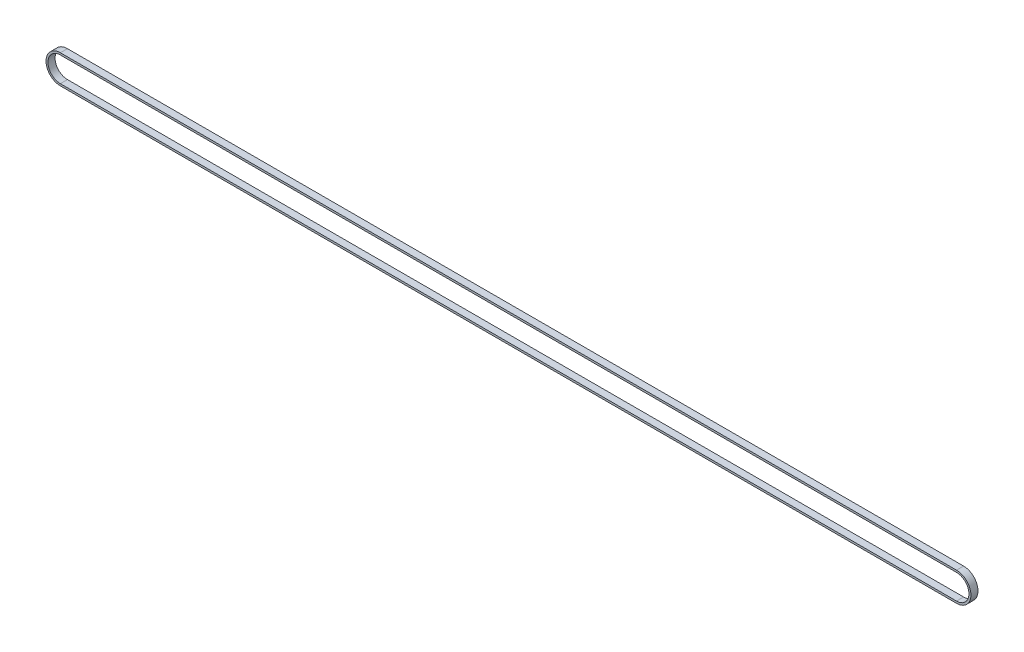
ISO-10303-21;
HEADER;
FILE_DESCRIPTION(('STEP AP214'),'2;1');
FILE_NAME('part.step','',(''),(''),'','','');
FILE_SCHEMA(('AUTOMOTIVE_DESIGN { 1 0 10303 214 1 1 1 1 }'));
ENDSEC;
DATA;
#1=APPLICATION_CONTEXT('core data for automotive mechanical design processes');
#2=APPLICATION_PROTOCOL_DEFINITION('international standard','automotive_design',2000,#1);
#3=PRODUCT_CONTEXT('',#1,'mechanical');
#4=PRODUCT('Part','Part','',(#3));
#5=PRODUCT_RELATED_PRODUCT_CATEGORY('part','',(#4));
#6=PRODUCT_DEFINITION_FORMATION('','',#4);
#7=PRODUCT_DEFINITION_CONTEXT('part definition',#1,'design');
#8=PRODUCT_DEFINITION('design','',#6,#7);
#9=PRODUCT_DEFINITION_SHAPE('','',#8);
#10=(LENGTH_UNIT() NAMED_UNIT(*) SI_UNIT(.MILLI.,.METRE.));
#11=(NAMED_UNIT(*) PLANE_ANGLE_UNIT() SI_UNIT($,.RADIAN.));
#12=(NAMED_UNIT(*) SI_UNIT($,.STERADIAN.) SOLID_ANGLE_UNIT());
#13=UNCERTAINTY_MEASURE_WITH_UNIT(LENGTH_MEASURE(1.E-05),#10,'distance_accuracy_value','');
#14=(GEOMETRIC_REPRESENTATION_CONTEXT(3) GLOBAL_UNCERTAINTY_ASSIGNED_CONTEXT((#13)) GLOBAL_UNIT_ASSIGNED_CONTEXT((#10,
#11,#12)) REPRESENTATION_CONTEXT('',''));
#15=CARTESIAN_POINT('',(0.,0.,0.));
#16=DIRECTION('',(0.,0.,1.));
#17=DIRECTION('',(1.,0.,0.));
#18=AXIS2_PLACEMENT_3D('',#15,#16,#17);
#19=CARTESIAN_POINT('',(0.,0.,2.5));
#20=DIRECTION('',(0.,0.,1.));
#21=DIRECTION('',(1.,0.,0.));
#22=AXIS2_PLACEMENT_3D('',#19,#20,#21);
#23=PLANE('',#22);
#24=CARTESIAN_POINT('',(0.,0.,2.5));
#25=DIRECTION('',(0.,0.,1.));
#26=DIRECTION('',(1.,0.,0.));
#27=AXIS2_PLACEMENT_3D('',#24,#25,#26);
#28=CIRCLE('',#27,10.13);
#29=CARTESIAN_POINT('',(0.,10.13,2.5));
#30=VERTEX_POINT('',#29);
#31=CARTESIAN_POINT('',(0.,-10.13,2.5));
#32=VERTEX_POINT('',#31);
#33=EDGE_CURVE('E159',#30,#32,#28,.T.);
#34=ORIENTED_EDGE('',*,*,#33,.T.);
#35=DIRECTION('',(1.,0.,0.));
#36=VECTOR('',#35,1.);
#37=CARTESIAN_POINT('',(632.,-10.13,2.5));
#38=LINE('',#37,#36);
#39=CARTESIAN_POINT('',(632.,-10.13,2.5));
#40=VERTEX_POINT('',#39);
#41=EDGE_CURVE('E162',#32,#40,#38,.T.);
#42=ORIENTED_EDGE('',*,*,#41,.T.);
#43=CARTESIAN_POINT('',(632.,0.,2.5));
#44=DIRECTION('',(0.,0.,1.));
#45=DIRECTION('',(1.,0.,0.));
#46=AXIS2_PLACEMENT_3D('',#43,#44,#45);
#47=CIRCLE('',#46,10.13);
#48=CARTESIAN_POINT('',(632.,10.13,2.5));
#49=VERTEX_POINT('',#48);
#50=EDGE_CURVE('E165',#40,#49,#47,.T.);
#51=ORIENTED_EDGE('',*,*,#50,.T.);
#52=DIRECTION('',(-1.,0.,0.));
#53=VECTOR('',#52,1.);
#54=CARTESIAN_POINT('',(0.,10.13,2.5));
#55=LINE('',#54,#53);
#56=EDGE_CURVE('E167',#49,#30,#55,.T.);
#57=ORIENTED_EDGE('',*,*,#56,.T.);
#58=EDGE_LOOP('',(#34,#42,#51,#57));
#59=FACE_BOUND('',#58,.T.);
#60=DIRECTION('',(1.,0.,0.));
#61=VECTOR('',#60,1.);
#62=CARTESIAN_POINT('',(632.,-8.75,2.5));
#63=LINE('',#62,#61);
#64=CARTESIAN_POINT('',(0.,-8.75,2.5));
#65=VERTEX_POINT('',#64);
#66=CARTESIAN_POINT('',(632.,-8.75,2.5));
#67=VERTEX_POINT('',#66);
#68=EDGE_CURVE('E131',#65,#67,#63,.T.);
#69=ORIENTED_EDGE('',*,*,#68,.F.);
#70=CARTESIAN_POINT('',(0.,0.,2.5));
#71=DIRECTION('',(0.,0.,1.));
#72=DIRECTION('',(1.,0.,0.));
#73=AXIS2_PLACEMENT_3D('',#70,#71,#72);
#74=CIRCLE('',#73,8.75);
#75=CARTESIAN_POINT('',(0.,8.75,2.5));
#76=VERTEX_POINT('',#75);
#77=EDGE_CURVE('E123',#76,#65,#74,.T.);
#78=ORIENTED_EDGE('',*,*,#77,.F.);
#79=DIRECTION('',(-1.,0.,0.));
#80=VECTOR('',#79,1.);
#81=CARTESIAN_POINT('',(0.,8.75,2.5));
#82=LINE('',#81,#80);
#83=CARTESIAN_POINT('',(632.,8.75,2.5));
#84=VERTEX_POINT('',#83);
#85=EDGE_CURVE('E145',#84,#76,#82,.T.);
#86=ORIENTED_EDGE('',*,*,#85,.F.);
#87=CARTESIAN_POINT('',(632.,0.,2.5));
#88=DIRECTION('',(0.,0.,1.));
#89=DIRECTION('',(1.,0.,0.));
#90=AXIS2_PLACEMENT_3D('',#87,#88,#89);
#91=CIRCLE('',#90,8.75);
#92=EDGE_CURVE('E143',#67,#84,#91,.T.);
#93=ORIENTED_EDGE('',*,*,#92,.F.);
#94=EDGE_LOOP('',(#69,#78,#86,#93));
#95=FACE_BOUND('',#94,.T.);
#96=ADVANCED_FACE('F58',(#59,#95),#23,.T.);
#97=CARTESIAN_POINT('',(0.,0.,-2.5));
#98=DIRECTION('',(0.,0.,1.));
#99=DIRECTION('',(1.,0.,0.));
#100=AXIS2_PLACEMENT_3D('',#97,#98,#99);
#101=PLANE('',#100);
#102=CARTESIAN_POINT('',(0.,0.,-2.5));
#103=DIRECTION('',(0.,0.,1.));
#104=DIRECTION('',(1.,0.,0.));
#105=AXIS2_PLACEMENT_3D('',#102,#103,#104);
#106=CIRCLE('',#105,10.13);
#107=CARTESIAN_POINT('',(0.,10.13,-2.5));
#108=VERTEX_POINT('',#107);
#109=CARTESIAN_POINT('',(0.,-10.13,-2.5));
#110=VERTEX_POINT('',#109);
#111=EDGE_CURVE('E139',#108,#110,#106,.T.);
#112=ORIENTED_EDGE('',*,*,#111,.F.);
#113=DIRECTION('',(-1.,0.,0.));
#114=VECTOR('',#113,1.);
#115=CARTESIAN_POINT('',(0.,10.13,-2.5));
#116=LINE('',#115,#114);
#117=CARTESIAN_POINT('',(632.,10.13,-2.5));
#118=VERTEX_POINT('',#117);
#119=EDGE_CURVE('E163',#118,#108,#116,.T.);
#120=ORIENTED_EDGE('',*,*,#119,.F.);
#121=CARTESIAN_POINT('',(632.,0.,-2.5));
#122=DIRECTION('',(0.,0.,1.));
#123=DIRECTION('',(1.,0.,0.));
#124=AXIS2_PLACEMENT_3D('',#121,#122,#123);
#125=CIRCLE('',#124,10.13);
#126=CARTESIAN_POINT('',(632.,-10.13,-2.5));
#127=VERTEX_POINT('',#126);
#128=EDGE_CURVE('E174',#127,#118,#125,.T.);
#129=ORIENTED_EDGE('',*,*,#128,.F.);
#130=DIRECTION('',(1.,0.,0.));
#131=VECTOR('',#130,1.);
#132=CARTESIAN_POINT('',(632.,-10.13,-2.5));
#133=LINE('',#132,#131);
#134=EDGE_CURVE('E172',#110,#127,#133,.T.);
#135=ORIENTED_EDGE('',*,*,#134,.F.);
#136=EDGE_LOOP('',(#112,#120,#129,#135));
#137=FACE_BOUND('',#136,.T.);
#138=CARTESIAN_POINT('',(0.,0.,-2.5));
#139=DIRECTION('',(0.,0.,1.));
#140=DIRECTION('',(1.,0.,0.));
#141=AXIS2_PLACEMENT_3D('',#138,#139,#140);
#142=CIRCLE('',#141,8.75);
#143=CARTESIAN_POINT('',(0.,8.75,-2.5));
#144=VERTEX_POINT('',#143);
#145=CARTESIAN_POINT('',(0.,-8.75,-2.5));
#146=VERTEX_POINT('',#145);
#147=EDGE_CURVE('E81',#144,#146,#142,.T.);
#148=ORIENTED_EDGE('',*,*,#147,.T.);
#149=DIRECTION('',(1.,0.,0.));
#150=VECTOR('',#149,1.);
#151=CARTESIAN_POINT('',(632.,-8.75,-2.5));
#152=LINE('',#151,#150);
#153=CARTESIAN_POINT('',(632.,-8.75,-2.5));
#154=VERTEX_POINT('',#153);
#155=EDGE_CURVE('E138',#146,#154,#152,.T.);
#156=ORIENTED_EDGE('',*,*,#155,.T.);
#157=CARTESIAN_POINT('',(632.,0.,-2.5));
#158=DIRECTION('',(0.,0.,1.));
#159=DIRECTION('',(1.,0.,0.));
#160=AXIS2_PLACEMENT_3D('',#157,#158,#159);
#161=CIRCLE('',#160,8.75);
#162=CARTESIAN_POINT('',(632.,8.75,-2.5));
#163=VERTEX_POINT('',#162);
#164=EDGE_CURVE('E151',#154,#163,#161,.T.);
#165=ORIENTED_EDGE('',*,*,#164,.T.);
#166=DIRECTION('',(-1.,0.,0.));
#167=VECTOR('',#166,1.);
#168=CARTESIAN_POINT('',(0.,8.75,-2.5));
#169=LINE('',#168,#167);
#170=EDGE_CURVE('E132',#163,#144,#169,.T.);
#171=ORIENTED_EDGE('',*,*,#170,.T.);
#172=EDGE_LOOP('',(#148,#156,#165,#171));
#173=FACE_BOUND('',#172,.T.);
#174=ADVANCED_FACE('F192',(#137,#173),#101,.F.);
#175=CARTESIAN_POINT('',(0.,0.,2.5));
#176=DIRECTION('',(0.,0.,-1.));
#177=DIRECTION('',(-1.,0.,0.));
#178=AXIS2_PLACEMENT_3D('',#175,#176,#177);
#179=CYLINDRICAL_SURFACE('',#178,10.13);
#180=ORIENTED_EDGE('',*,*,#111,.T.);
#181=DIRECTION('',(0.,0.,-1.));
#182=VECTOR('',#181,1.);
#183=CARTESIAN_POINT('',(0.,-10.13,2.5));
#184=LINE('',#183,#182);
#185=EDGE_CURVE('E12',#32,#110,#184,.T.);
#186=ORIENTED_EDGE('',*,*,#185,.F.);
#187=ORIENTED_EDGE('',*,*,#33,.F.);
#188=DIRECTION('',(0.,0.,-1.));
#189=VECTOR('',#188,1.);
#190=CARTESIAN_POINT('',(0.,10.13,2.5));
#191=LINE('',#190,#189);
#192=EDGE_CURVE('E169',#30,#108,#191,.T.);
#193=ORIENTED_EDGE('',*,*,#192,.T.);
#194=EDGE_LOOP('',(#180,#186,#187,#193));
#195=FACE_BOUND('',#194,.T.);
#196=ADVANCED_FACE('F60',(#195),#179,.T.);
#197=CARTESIAN_POINT('',(632.,-10.13,2.5));
#198=DIRECTION('',(0.,1.,0.));
#199=DIRECTION('',(0.,0.,1.));
#200=AXIS2_PLACEMENT_3D('',#197,#198,#199);
#201=PLANE('',#200);
#202=ORIENTED_EDGE('',*,*,#134,.T.);
#203=DIRECTION('',(0.,0.,-1.));
#204=VECTOR('',#203,1.);
#205=CARTESIAN_POINT('',(632.,-10.13,2.5));
#206=LINE('',#205,#204);
#207=EDGE_CURVE('E66',#40,#127,#206,.T.);
#208=ORIENTED_EDGE('',*,*,#207,.F.);
#209=ORIENTED_EDGE('',*,*,#41,.F.);
#210=ORIENTED_EDGE('',*,*,#185,.T.);
#211=EDGE_LOOP('',(#202,#208,#209,#210));
#212=FACE_BOUND('',#211,.T.);
#213=ADVANCED_FACE('F202',(#212),#201,.F.);
#214=CARTESIAN_POINT('',(632.,0.,2.5));
#215=DIRECTION('',(0.,0.,-1.));
#216=DIRECTION('',(-1.,0.,0.));
#217=AXIS2_PLACEMENT_3D('',#214,#215,#216);
#218=CYLINDRICAL_SURFACE('',#217,10.13);
#219=ORIENTED_EDGE('',*,*,#128,.T.);
#220=DIRECTION('',(0.,0.,-1.));
#221=VECTOR('',#220,1.);
#222=CARTESIAN_POINT('',(632.,10.13,2.5));
#223=LINE('',#222,#221);
#224=EDGE_CURVE('E179',#49,#118,#223,.T.);
#225=ORIENTED_EDGE('',*,*,#224,.F.);
#226=ORIENTED_EDGE('',*,*,#50,.F.);
#227=ORIENTED_EDGE('',*,*,#207,.T.);
#228=EDGE_LOOP('',(#219,#225,#226,#227));
#229=FACE_BOUND('',#228,.T.);
#230=ADVANCED_FACE('F186',(#229),#218,.T.);
#231=CARTESIAN_POINT('',(0.,10.13,2.5));
#232=DIRECTION('',(0.,-1.,0.));
#233=DIRECTION('',(0.,0.,-1.));
#234=AXIS2_PLACEMENT_3D('',#231,#232,#233);
#235=PLANE('',#234);
#236=ORIENTED_EDGE('',*,*,#119,.T.);
#237=ORIENTED_EDGE('',*,*,#192,.F.);
#238=ORIENTED_EDGE('',*,*,#56,.F.);
#239=ORIENTED_EDGE('',*,*,#224,.T.);
#240=EDGE_LOOP('',(#236,#237,#238,#239));
#241=FACE_BOUND('',#240,.T.);
#242=ADVANCED_FACE('F196',(#241),#235,.F.);
#243=CARTESIAN_POINT('',(0.,0.,2.5));
#244=DIRECTION('',(0.,0.,-1.));
#245=DIRECTION('',(-1.,0.,0.));
#246=AXIS2_PLACEMENT_3D('',#243,#244,#245);
#247=CYLINDRICAL_SURFACE('',#246,8.75);
#248=ORIENTED_EDGE('',*,*,#147,.F.);
#249=DIRECTION('',(0.,0.,-1.));
#250=VECTOR('',#249,1.);
#251=CARTESIAN_POINT('',(0.,8.75,2.5));
#252=LINE('',#251,#250);
#253=EDGE_CURVE('E127',#76,#144,#252,.T.);
#254=ORIENTED_EDGE('',*,*,#253,.F.);
#255=ORIENTED_EDGE('',*,*,#77,.T.);
#256=DIRECTION('',(0.,0.,-1.));
#257=VECTOR('',#256,1.);
#258=CARTESIAN_POINT('',(0.,-8.75,2.5));
#259=LINE('',#258,#257);
#260=EDGE_CURVE('E126',#65,#146,#259,.T.);
#261=ORIENTED_EDGE('',*,*,#260,.T.);
#262=EDGE_LOOP('',(#248,#254,#255,#261));
#263=FACE_BOUND('',#262,.T.);
#264=ADVANCED_FACE('F125',(#263),#247,.F.);
#265=CARTESIAN_POINT('',(632.,-8.75,2.5));
#266=DIRECTION('',(0.,1.,0.));
#267=DIRECTION('',(0.,0.,1.));
#268=AXIS2_PLACEMENT_3D('',#265,#266,#267);
#269=PLANE('',#268);
#270=ORIENTED_EDGE('',*,*,#155,.F.);
#271=ORIENTED_EDGE('',*,*,#260,.F.);
#272=ORIENTED_EDGE('',*,*,#68,.T.);
#273=DIRECTION('',(0.,0.,-1.));
#274=VECTOR('',#273,1.);
#275=CARTESIAN_POINT('',(632.,-8.75,2.5));
#276=LINE('',#275,#274);
#277=EDGE_CURVE('E140',#67,#154,#276,.T.);
#278=ORIENTED_EDGE('',*,*,#277,.T.);
#279=EDGE_LOOP('',(#270,#271,#272,#278));
#280=FACE_BOUND('',#279,.T.);
#281=ADVANCED_FACE('F135',(#280),#269,.T.);
#282=CARTESIAN_POINT('',(632.,0.,2.5));
#283=DIRECTION('',(0.,0.,-1.));
#284=DIRECTION('',(-1.,0.,0.));
#285=AXIS2_PLACEMENT_3D('',#282,#283,#284);
#286=CYLINDRICAL_SURFACE('',#285,8.75);
#287=ORIENTED_EDGE('',*,*,#164,.F.);
#288=ORIENTED_EDGE('',*,*,#277,.F.);
#289=ORIENTED_EDGE('',*,*,#92,.T.);
#290=DIRECTION('',(0.,0.,-1.));
#291=VECTOR('',#290,1.);
#292=CARTESIAN_POINT('',(632.,8.75,2.5));
#293=LINE('',#292,#291);
#294=EDGE_CURVE('E73',#84,#163,#293,.T.);
#295=ORIENTED_EDGE('',*,*,#294,.T.);
#296=EDGE_LOOP('',(#287,#288,#289,#295));
#297=FACE_BOUND('',#296,.T.);
#298=ADVANCED_FACE('F225',(#297),#286,.F.);
#299=CARTESIAN_POINT('',(0.,8.75,2.5));
#300=DIRECTION('',(0.,-1.,0.));
#301=DIRECTION('',(0.,0.,-1.));
#302=AXIS2_PLACEMENT_3D('',#299,#300,#301);
#303=PLANE('',#302);
#304=ORIENTED_EDGE('',*,*,#170,.F.);
#305=ORIENTED_EDGE('',*,*,#294,.F.);
#306=ORIENTED_EDGE('',*,*,#85,.T.);
#307=ORIENTED_EDGE('',*,*,#253,.T.);
#308=EDGE_LOOP('',(#304,#305,#306,#307));
#309=FACE_BOUND('',#308,.T.);
#310=ADVANCED_FACE('F229',(#309),#303,.T.);
#311=CLOSED_SHELL('',(#96,#174,#196,#213,#230,#242,#264,#281,#298,#310));
#312=MANIFOLD_SOLID_BREP('B2',#311);
#313=ADVANCED_BREP_SHAPE_REPRESENTATION('',(#18,#312),#14);
#314=SHAPE_DEFINITION_REPRESENTATION(#9,#313);
ENDSEC;
END-ISO-10303-21;
